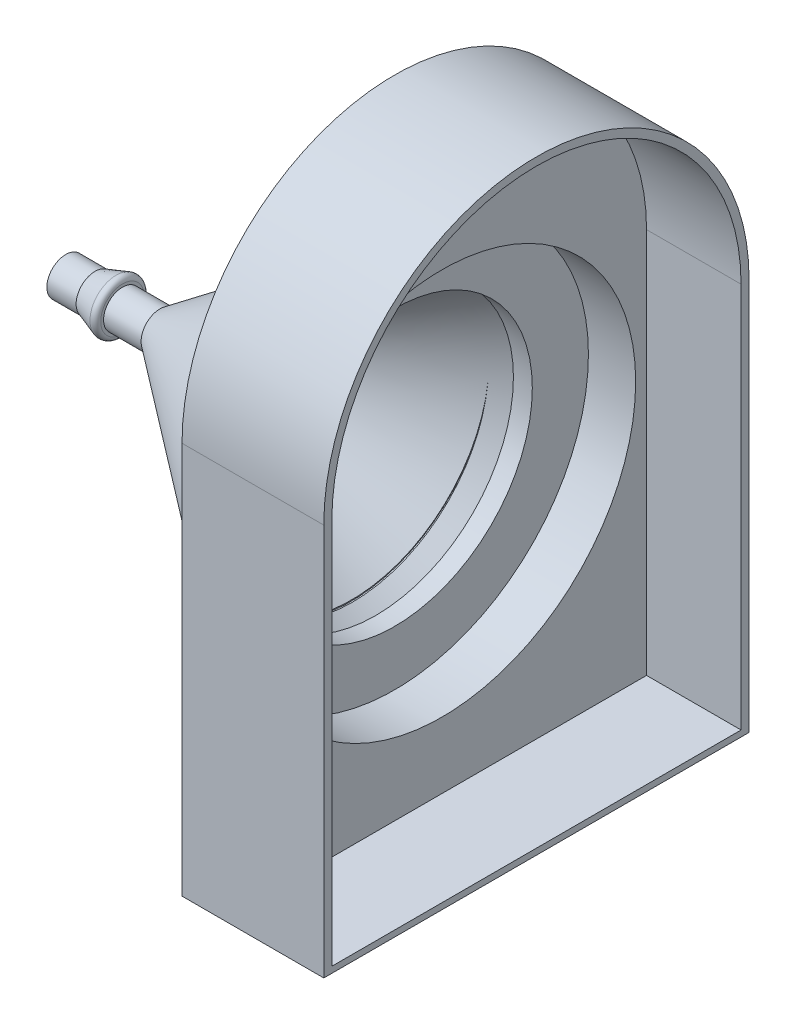
ISO-10303-21;
HEADER;
FILE_DESCRIPTION(('STEP AP214'),'2;1');
FILE_NAME('part.step','',(''),(''),'','','');
FILE_SCHEMA(('AUTOMOTIVE_DESIGN { 1 0 10303 214 1 1 1 1 }'));
ENDSEC;
DATA;
#1=APPLICATION_CONTEXT('core data for automotive mechanical design processes');
#2=APPLICATION_PROTOCOL_DEFINITION('international standard','automotive_design',2000,#1);
#3=PRODUCT_CONTEXT('',#1,'mechanical');
#4=PRODUCT('Part','Part','',(#3));
#5=PRODUCT_RELATED_PRODUCT_CATEGORY('part','',(#4));
#6=PRODUCT_DEFINITION_FORMATION('','',#4);
#7=PRODUCT_DEFINITION_CONTEXT('part definition',#1,'design');
#8=PRODUCT_DEFINITION('design','',#6,#7);
#9=PRODUCT_DEFINITION_SHAPE('','',#8);
#10=(LENGTH_UNIT() NAMED_UNIT(*) SI_UNIT(.MILLI.,.METRE.));
#11=(NAMED_UNIT(*) PLANE_ANGLE_UNIT() SI_UNIT($,.RADIAN.));
#12=(NAMED_UNIT(*) SI_UNIT($,.STERADIAN.) SOLID_ANGLE_UNIT());
#13=UNCERTAINTY_MEASURE_WITH_UNIT(LENGTH_MEASURE(1.E-05),#10,'distance_accuracy_value','');
#14=(GEOMETRIC_REPRESENTATION_CONTEXT(3) GLOBAL_UNCERTAINTY_ASSIGNED_CONTEXT((#13)) GLOBAL_UNIT_ASSIGNED_CONTEXT((#10,
#11,#12)) REPRESENTATION_CONTEXT('',''));
#15=CARTESIAN_POINT('',(0.,0.,0.));
#16=DIRECTION('',(0.,0.,1.));
#17=DIRECTION('',(1.,0.,0.));
#18=AXIS2_PLACEMENT_3D('',#15,#16,#17);
#19=CARTESIAN_POINT('',(-44.196,10.4774140012512,0.));
#20=DIRECTION('',(1.,0.,0.));
#21=DIRECTION('',(0.,0.,-1.));
#22=AXIS2_PLACEMENT_3D('',#19,#20,#21);
#23=CYLINDRICAL_SURFACE('',#22,2.54);
#24=CARTESIAN_POINT('',(-31.496,10.4774140012512,0.));
#25=DIRECTION('',(1.,0.,0.));
#26=DIRECTION('',(0.,0.,-1.));
#27=AXIS2_PLACEMENT_3D('',#24,#25,#26);
#28=CIRCLE('',#27,2.54);
#29=CARTESIAN_POINT('',(-31.496,10.4774140012512,-2.54));
#30=VERTEX_POINT('',#29);
#31=EDGE_CURVE('E69',#30,#30,#28,.T.);
#32=ORIENTED_EDGE('',*,*,#31,.F.);
#33=EDGE_LOOP('',(#32));
#34=FACE_BOUND('',#33,.T.);
#35=CARTESIAN_POINT('',(-36.576,10.4774140012512,0.));
#36=DIRECTION('',(-1.,0.,0.));
#37=DIRECTION('',(0.,0.,1.));
#38=AXIS2_PLACEMENT_3D('',#35,#36,#37);
#39=CIRCLE('',#38,2.54);
#40=CARTESIAN_POINT('',(-36.576,10.4774140012512,2.54));
#41=VERTEX_POINT('',#40);
#42=EDGE_CURVE('E78',#41,#41,#39,.T.);
#43=ORIENTED_EDGE('',*,*,#42,.F.);
#44=EDGE_LOOP('',(#43));
#45=FACE_BOUND('',#44,.T.);
#46=ADVANCED_FACE('F54',(#34,#45),#23,.T.);
#47=CARTESIAN_POINT('',(-44.196,10.4774140012512,0.));
#48=DIRECTION('',(1.,0.,0.));
#49=DIRECTION('',(0.,0.,-1.));
#50=AXIS2_PLACEMENT_3D('',#47,#48,#49);
#51=CIRCLE('',#50,2.54);
#52=CARTESIAN_POINT('',(-44.196,10.4774140012512,-2.54));
#53=VERTEX_POINT('',#52);
#54=EDGE_CURVE('E65',#53,#53,#51,.T.);
#55=ORIENTED_EDGE('',*,*,#54,.T.);
#56=EDGE_LOOP('',(#55));
#57=FACE_BOUND('',#56,.T.);
#58=CARTESIAN_POINT('',(-40.2646161105656,10.4774140012512,0.));
#59=DIRECTION('',(-1.,0.,0.));
#60=DIRECTION('',(0.,0.,1.));
#61=AXIS2_PLACEMENT_3D('',#58,#59,#60);
#62=CIRCLE('',#61,2.54);
#63=CARTESIAN_POINT('',(-40.2646161105656,10.4774140012512,2.54));
#64=VERTEX_POINT('',#63);
#65=EDGE_CURVE('E83',#64,#64,#62,.T.);
#66=ORIENTED_EDGE('',*,*,#65,.T.);
#67=EDGE_LOOP('',(#66));
#68=FACE_BOUND('',#67,.T.);
#69=ADVANCED_FACE('F87',(#57,#68),#23,.T.);
#70=CARTESIAN_POINT('',(-44.196,10.4774140012512,0.));
#71=DIRECTION('',(1.,0.,0.));
#72=DIRECTION('',(0.,0.,-1.));
#73=AXIS2_PLACEMENT_3D('',#70,#71,#72);
#74=PLANE('',#73);
#75=CARTESIAN_POINT('',(-44.196,10.4774140012512,0.));
#76=DIRECTION('',(1.,0.,0.));
#77=DIRECTION('',(0.,0.,-1.));
#78=AXIS2_PLACEMENT_3D('',#75,#76,#77);
#79=CIRCLE('',#78,1.27);
#80=CARTESIAN_POINT('',(-44.196,10.4774140012512,-1.27));
#81=VERTEX_POINT('',#80);
#82=EDGE_CURVE('E73',#81,#81,#79,.T.);
#83=ORIENTED_EDGE('',*,*,#82,.T.);
#84=EDGE_LOOP('',(#83));
#85=FACE_BOUND('',#84,.T.);
#86=ORIENTED_EDGE('',*,*,#54,.F.);
#87=EDGE_LOOP('',(#86));
#88=FACE_BOUND('',#87,.T.);
#89=ADVANCED_FACE('F105',(#85,#88),#74,.F.);
#90=CARTESIAN_POINT('',(-31.496,10.4774140012512,0.));
#91=DIRECTION('',(1.,0.,0.));
#92=DIRECTION('',(0.,0.,-1.));
#93=AXIS2_PLACEMENT_3D('',#90,#91,#92);
#94=PLANE('',#93);
#95=CARTESIAN_POINT('',(-31.496,10.4774140012512,0.));
#96=DIRECTION('',(1.,0.,0.));
#97=DIRECTION('',(0.,0.,-1.));
#98=AXIS2_PLACEMENT_3D('',#95,#96,#97);
#99=CIRCLE('',#98,1.27);
#100=CARTESIAN_POINT('',(-31.496,10.4774140012512,-1.27));
#101=VERTEX_POINT('',#100);
#102=EDGE_CURVE('E75',#101,#101,#99,.T.);
#103=ORIENTED_EDGE('',*,*,#102,.F.);
#104=EDGE_LOOP('',(#103));
#105=FACE_BOUND('',#104,.T.);
#106=ORIENTED_EDGE('',*,*,#31,.T.);
#107=EDGE_LOOP('',(#106));
#108=FACE_BOUND('',#107,.T.);
#109=ADVANCED_FACE('F110',(#105,#108),#94,.T.);
#110=CARTESIAN_POINT('',(-44.196,10.4774140012512,0.));
#111=DIRECTION('',(1.,0.,0.));
#112=DIRECTION('',(0.,0.,-1.));
#113=AXIS2_PLACEMENT_3D('',#110,#111,#112);
#114=CYLINDRICAL_SURFACE('',#113,1.27);
#115=ORIENTED_EDGE('',*,*,#82,.F.);
#116=EDGE_LOOP('',(#115));
#117=FACE_BOUND('',#116,.T.);
#118=ORIENTED_EDGE('',*,*,#102,.T.);
#119=EDGE_LOOP('',(#118));
#120=FACE_BOUND('',#119,.T.);
#121=ADVANCED_FACE('F98',(#117,#120),#114,.F.);
#122=CARTESIAN_POINT('',(-36.576,6.66741400125122,0.));
#123=DIRECTION('',(-1.,0.,0.));
#124=DIRECTION('',(0.,0.,1.));
#125=AXIS2_PLACEMENT_3D('',#122,#123,#124);
#126=PLANE('',#125);
#127=CARTESIAN_POINT('',(-36.576,10.4774140012512,0.));
#128=DIRECTION('',(-1.,0.,0.));
#129=DIRECTION('',(0.,0.,1.));
#130=AXIS2_PLACEMENT_3D('',#127,#128,#129);
#131=CIRCLE('',#130,2.91978391418075);
#132=CARTESIAN_POINT('',(-36.576,10.4774140012512,2.91978391418075));
#133=VERTEX_POINT('',#132);
#134=EDGE_CURVE('E12',#133,#133,#131,.F.);
#135=ORIENTED_EDGE('',*,*,#134,.T.);
#136=EDGE_LOOP('',(#135));
#137=FACE_BOUND('',#136,.T.);
#138=ORIENTED_EDGE('',*,*,#42,.T.);
#139=EDGE_LOOP('',(#138));
#140=FACE_BOUND('',#139,.T.);
#141=ADVANCED_FACE('F91',(#137,#140),#126,.F.);
#142=CARTESIAN_POINT('',(-36.576,10.4774140012512,0.));
#143=DIRECTION('',(1.,0.,0.));
#144=DIRECTION('',(0.,0.,-1.));
#145=AXIS2_PLACEMENT_3D('',#142,#143,#144);
#146=CONICAL_SURFACE('',#145,3.81,0.331590167268356);
#147=CARTESIAN_POINT('',(-37.4177223346097,10.4774140012512,0.));
#148=DIRECTION('',(-1.,0.,0.));
#149=DIRECTION('',(0.,0.,1.));
#150=AXIS2_PLACEMENT_3D('',#147,#148,#149);
#151=CIRCLE('',#150,3.5201928384761);
#152=CARTESIAN_POINT('',(-37.4177223346097,10.4774140012512,3.52019283847611));
#153=VERTEX_POINT('',#152);
#154=EDGE_CURVE('E61',#153,#153,#151,.T.);
#155=ORIENTED_EDGE('',*,*,#154,.T.);
#156=EDGE_LOOP('',(#155));
#157=FACE_BOUND('',#156,.T.);
#158=ORIENTED_EDGE('',*,*,#65,.F.);
#159=EDGE_LOOP('',(#158));
#160=FACE_BOUND('',#159,.T.);
#161=ADVANCED_FACE('F89',(#157,#160),#146,.T.);
#162=CARTESIAN_POINT('',(-37.211,10.4774140012512,0.));
#163=DIRECTION('',(-1.,0.,0.));
#164=DIRECTION('',(0.,0.,1.));
#165=AXIS2_PLACEMENT_3D('',#162,#163,#164);
#166=TOROIDAL_SURFACE('',#165,2.91978391418075,0.635);
#167=ORIENTED_EDGE('',*,*,#134,.F.);
#168=EDGE_LOOP('',(#167));
#169=FACE_BOUND('',#168,.T.);
#170=ORIENTED_EDGE('',*,*,#154,.F.);
#171=EDGE_LOOP('',(#170));
#172=FACE_BOUND('',#171,.T.);
#173=ADVANCED_FACE('F56',(#169,#172),#166,.T.);
#174=CLOSED_SHELL('',(#46,#69,#89,#109,#121,#141,#161,#173));
#175=MANIFOLD_SOLID_BREP('B2',#174);
#176=CARTESIAN_POINT('',(-2.54,10.4774140012512,0.));
#177=DIRECTION('',(1.,0.,0.));
#178=DIRECTION('',(0.,0.,-1.));
#179=AXIS2_PLACEMENT_3D('',#176,#177,#178);
#180=CONICAL_SURFACE('',#179,20.9753037049337,0.640293421318562);
#181=CARTESIAN_POINT('',(-5.842,10.4774140012512,0.));
#182=DIRECTION('',(1.,0.,0.));
#183=DIRECTION('',(0.,0.,-1.));
#184=AXIS2_PLACEMENT_3D('',#181,#182,#183);
#185=CIRCLE('',#184,18.5153137049337);
#186=CARTESIAN_POINT('',(-5.842,8.14576508197144,-18.3679137331741));
#187=VERTEX_POINT('',#186);
#188=CARTESIAN_POINT('',(-5.842,8.14576508197114,18.3679137331741));
#189=VERTEX_POINT('',#188);
#190=EDGE_CURVE('E52',#187,#189,#185,.F.);
#191=ORIENTED_EDGE('',*,*,#190,.F.);
#192=CARTESIAN_POINT('',(-6.05230168996605,26.8157734980068,-8.37243291409508));
#193=CARTESIAN_POINT('',(-6.04980473854419,26.5950424745286,-8.80735233484811));
#194=CARTESIAN_POINT('',(-6.04711275181182,26.3570375411272,-9.23349512453131));
#195=CARTESIAN_POINT('',(-6.04135786034432,25.8481384871763,-10.065649726821));
#196=CARTESIAN_POINT('',(-6.03829496619137,25.5772453049442,-10.4716621132921));
#197=CARTESIAN_POINT('',(-6.03181739071217,25.004226471406,-11.2609883302905));
#198=CARTESIAN_POINT('',(-6.02840272273173,24.70210200497,-11.6443030210686));
#199=CARTESIAN_POINT('',(-6.02124348313159,24.0685191199073,-12.3858543455973));
#200=CARTESIAN_POINT('',(-6.01749891738637,23.7370612236197,-12.7440914257005));
#201=CARTESIAN_POINT('',(-6.00970196539864,23.0467277715894,-13.4334025054827));
#202=CARTESIAN_POINT('',(-6.00564944659553,22.687840408248,-13.7644646785122));
#203=CARTESIAN_POINT('',(-5.99726376630634,21.9450162759844,-14.3971853851101));
#204=CARTESIAN_POINT('',(-5.99293060247672,21.5610792978841,-14.6988436730874));
#205=CARTESIAN_POINT('',(-5.98401460612358,20.7708631384469,-15.2706497765345));
#206=CARTESIAN_POINT('',(-5.97943196211863,20.3646008250212,-15.5408209132644));
#207=CARTESIAN_POINT('',(-5.97004334681625,19.5320343344303,-16.0482065468793));
#208=CARTESIAN_POINT('',(-5.96523740093005,19.105732437657,-16.2854247815272));
#209=CARTESIAN_POINT('',(-5.95631740563273,18.3142615926053,-16.6857363496884));
#210=CARTESIAN_POINT('',(-5.95223492834234,17.9519365433589,-16.8544819146478));
#211=CARTESIAN_POINT('',(-5.94395654448104,17.2170323413388,-17.168198112806));
#212=CARTESIAN_POINT('',(-5.93976061408196,16.8444510341761,-17.3131637056825));
#213=CARTESIAN_POINT('',(-5.93127353683828,16.0906373507087,-17.5786751006344));
#214=CARTESIAN_POINT('',(-5.92698237864394,15.7094039430768,-17.6992179743494));
#215=CARTESIAN_POINT('',(-5.91832455957951,14.9400256205933,-17.9153337696594));
#216=CARTESIAN_POINT('',(-5.91395791480488,14.551882178604,-18.0109119459558));
#217=CARTESIAN_POINT('',(-5.90417517731427,13.6820783210078,-18.1954243530013));
#218=CARTESIAN_POINT('',(-5.89874436188458,13.1990566326072,-18.2780065394556));
#219=CARTESIAN_POINT('',(-5.88782950288641,12.2279563234509,-18.4045940997027));
#220=CARTESIAN_POINT('',(-5.88234545384616,11.7398771824953,-18.4485954644826));
#221=CARTESIAN_POINT('',(-5.87135593013218,10.7614859659437,-18.497750414664));
#222=CARTESIAN_POINT('',(-5.86585044521313,10.2711727966331,-18.5028823160469));
#223=CARTESIAN_POINT('',(-5.85485595529443,9.29168874135649,-18.4742084916179));
#224=CARTESIAN_POINT('',(-5.84936695050591,8.80251787004248,-18.4404022690727));
#225=CARTESIAN_POINT('',(-5.83810483953252,7.7985271883295,-18.3307995971587));
#226=CARTESIAN_POINT('',(-5.8323349368585,7.28397262798859,-18.252556866722));
#227=CARTESIAN_POINT('',(-5.8208932784871,6.2632661442316,-18.0529987201885));
#228=CARTESIAN_POINT('',(-5.815221527603,5.75711463294252,-17.9316811979855));
#229=CARTESIAN_POINT('',(-5.80401585834689,4.75677746534084,-17.6468217221999));
#230=CARTESIAN_POINT('',(-5.79848195378565,4.26259300814015,-17.483275556253));
#231=CARTESIAN_POINT('',(-5.78759169469912,3.28976490473196,-17.115129507112));
#232=CARTESIAN_POINT('',(-5.78223533851479,2.81112111331078,-16.9105300076531));
#233=CARTESIAN_POINT('',(-5.77169891750903,1.86929474659687,-16.4600669296335));
#234=CARTESIAN_POINT('',(-5.76652045140187,1.40625286930386,-16.2139090744741));
#235=CARTESIAN_POINT('',(-5.75641875354378,0.502723108935721,-15.6831741201335));
#236=CARTESIAN_POINT('',(-5.75149552651646,0.0622356432685031,-15.3985963102797));
#237=CARTESIAN_POINT('',(-5.74194028772314,-0.792922650028691,-14.7931320380016));
#238=CARTESIAN_POINT('',(-5.73730822601058,-1.20759790537052,-14.4722518294837));
#239=CARTESIAN_POINT('',(-5.72836742505071,-2.00821147296286,-13.796464007714));
#240=CARTESIAN_POINT('',(-5.72405867202017,-2.3941510102628,-13.4415578465199));
#241=CARTESIAN_POINT('',(-5.71603256668581,-3.1132289032629,-12.7215968051549));
#242=CARTESIAN_POINT('',(-5.71229545760603,-3.44812705523642,-12.3582973189461));
#243=CARTESIAN_POINT('',(-5.70515906494656,-4.08778019817246,-11.6060849901983));
#244=CARTESIAN_POINT('',(-5.70175976491031,-4.39253665750054,-11.2171733969031));
#245=CARTESIAN_POINT('',(-5.69532026878391,-4.96996050268395,-10.416223100135));
#246=CARTESIAN_POINT('',(-5.69228006724037,-5.24262837584599,-10.0041847480122));
#247=CARTESIAN_POINT('',(-5.68657767578494,-5.75414308713789,-9.15960284962658));
#248=CARTESIAN_POINT('',(-5.68391550296606,-5.9929883959392,-8.7270583773341));
#249=CARTESIAN_POINT('',(-5.67885499944746,-6.44706943240713,-7.82078031336759));
#250=CARTESIAN_POINT('',(-5.67647819210605,-6.6603774087399,-7.34607924749692));
#251=CARTESIAN_POINT('',(-5.67217902317542,-7.04625342975241,-6.3803843770447));
#252=CARTESIAN_POINT('',(-5.67025667729301,-7.21882006635654,-5.88939001001341));
#253=CARTESIAN_POINT('',(-5.6668795801219,-7.52200443799372,-4.89453150371542));
#254=CARTESIAN_POINT('',(-5.66542489954797,-7.65261582905294,-4.39066543056518));
#255=CARTESIAN_POINT('',(-5.66299365588127,-7.87092268686198,-3.37372448751583));
#256=CARTESIAN_POINT('',(-5.66201708864364,-7.95861852565595,-2.86064969748903));
#257=CARTESIAN_POINT('',(-5.66054890891197,-8.09046511074899,-1.82899269444716));
#258=CARTESIAN_POINT('',(-5.6600572423712,-8.13462071001457,-1.31041110173072));
#259=CARTESIAN_POINT('',(-5.65956208547841,-8.1790897802088,-0.271370293009217));
#260=CARTESIAN_POINT('',(-5.65955859610024,-8.17940316367742,0.249088926739414));
#261=CARTESIAN_POINT('',(-5.66003981249805,-8.13618604396935,1.28816753880295));
#262=CARTESIAN_POINT('',(-5.66052450322563,-8.09265689226147,1.80678698733524));
#263=CARTESIAN_POINT('',(-5.66197869445956,-7.96206634925218,2.83851486272808));
#264=CARTESIAN_POINT('',(-5.66294819472381,-7.87500497968813,3.35162329234038));
#265=CARTESIAN_POINT('',(-5.66536526812203,-7.65797004677165,4.36867753141245));
#266=CARTESIAN_POINT('',(-5.66681283748241,-7.52799682213878,4.87262341316256));
#267=CARTESIAN_POINT('',(-5.6701760028574,-7.22606230901372,5.86777422282941));
#268=CARTESIAN_POINT('',(-5.67209159892533,-7.05410101573812,6.35897914929466));
#269=CARTESIAN_POINT('',(-5.67637754064079,-6.66941077079271,7.32516237746161));
#270=CARTESIAN_POINT('',(-5.67874789215828,-6.45668129289019,7.80014046961527));
#271=CARTESIAN_POINT('',(-5.68392685305961,-5.99196891453579,8.73048689466527));
#272=CARTESIAN_POINT('',(-5.68673546242937,-5.73998601534472,9.18585522819147));
#273=CARTESIAN_POINT('',(-5.69277157613522,-5.19854285344625,10.0737710916267));
#274=CARTESIAN_POINT('',(-5.69599910478795,-4.90908041519827,10.5063172947473));
#275=CARTESIAN_POINT('',(-5.702850451791,-4.29474801835679,11.3454857108227));
#276=CARTESIAN_POINT('',(-5.70647427029356,-3.96987804616032,11.7521079138177));
#277=CARTESIAN_POINT('',(-5.7140926190938,-3.28706848446988,12.5365056787777));
#278=CARTESIAN_POINT('',(-5.71808711891129,-2.92913161399434,12.9142836078864));
#279=CARTESIAN_POINT('',(-5.72641917328571,-2.18271254121966,13.6383437773436));
#280=CARTESIAN_POINT('',(-5.73075672719462,-1.7942303966197,13.9846260771838));
#281=CARTESIAN_POINT('',(-5.73974401186123,-0.989532198198054,14.6431914995107));
#282=CARTESIAN_POINT('',(-5.74439369906915,-0.573320013417028,14.9554793491335));
#283=CARTESIAN_POINT('',(-5.75397303829735,0.283910463521951,15.543886157369));
#284=CARTESIAN_POINT('',(-5.75890269238121,0.724928938521203,15.8200048493373));
#285=CARTESIAN_POINT('',(-5.76901066241772,1.62892951721605,16.3342639200963));
#286=CARTESIAN_POINT('',(-5.77418909498288,2.09192191972582,16.5723862579526));
#287=CARTESIAN_POINT('',(-5.78211197353838,2.80005922287906,16.8996127717003));
#288=CARTESIAN_POINT('',(-5.78477889295615,3.03838765946818,17.0036983102751));
#289=CARTESIAN_POINT('',(-5.79016103305838,3.51928235305153,17.201758396554));
#290=CARTESIAN_POINT('',(-5.79287626601155,3.76184968618192,17.2957303320473));
#291=CARTESIAN_POINT('',(-5.80109016193194,4.49552197737526,17.562293662239));
#292=CARTESIAN_POINT('',(-5.80665414322904,4.99233992100443,17.7194137085111));
#293=CARTESIAN_POINT('',(-5.81791453497745,5.99745451997204,17.9911812709801));
#294=CARTESIAN_POINT('',(-5.82361094470221,6.50575111233481,18.1058290201339));
#295=CARTESIAN_POINT('',(-5.83221835040813,7.27353043043318,18.2452579294493));
#296=CARTESIAN_POINT('',(-5.83509574607454,7.5301494118166,18.2862916400122));
#297=CARTESIAN_POINT('',(-5.84086761491574,8.04482052828199,18.3575066907022));
#298=CARTESIAN_POINT('',(-5.8437620838429,8.30287230603421,18.3876906232303));
#299=CARTESIAN_POINT('',(-5.85246253477148,9.07841073055843,18.461867012552));
#300=CARTESIAN_POINT('',(-5.85828888968606,9.59757739748629,18.4895379458712));
#301=CARTESIAN_POINT('',(-5.86800689044177,10.4632096630318,18.499178662862));
#302=CARTESIAN_POINT('',(-5.87189664859658,10.8096088730079,18.4932994681876));
#303=CARTESIAN_POINT('',(-5.87966825605479,11.5015406006295,18.4621109019674));
#304=CARTESIAN_POINT('',(-5.88355010515047,11.8470730955661,18.436801026541));
#305=CARTESIAN_POINT('',(-5.8932287381555,12.7083892935413,18.3493140581702));
#306=CARTESIAN_POINT('',(-5.89901362526704,13.2230133313104,18.2750372924714));
#307=CARTESIAN_POINT('',(-5.90762493508412,13.9888116873123,18.1313664366136));
#308=CARTESIAN_POINT('',(-5.9104851900944,14.2431278933992,18.0780800156546));
#309=CARTESIAN_POINT('',(-5.91617962274307,14.7493548692327,17.9608315560037));
#310=CARTESIAN_POINT('',(-5.91901379408798,15.0012650589825,17.8968670086382));
#311=CARTESIAN_POINT('',(-5.92747735322752,15.753405291458,17.6889076856936));
#312=CARTESIAN_POINT('',(-5.93305973663687,16.249329175703,17.5289815555392));
#313=CARTESIAN_POINT('',(-5.94405586332864,17.2258742441431,17.1678913418286));
#314=CARTESIAN_POINT('',(-5.94946960209103,17.7064950181896,16.9667261540707));
#315=CARTESIAN_POINT('',(-5.96008580188136,18.6486816284183,16.5247608640005));
#316=CARTESIAN_POINT('',(-5.96528843654291,19.1102631298391,16.283994193052));
#317=CARTESIAN_POINT('',(-5.97544977920616,20.011512993004,15.7644106427805));
#318=CARTESIAN_POINT('',(-5.98040847895719,20.4511806135564,15.485592477635));
#319=CARTESIAN_POINT('',(-5.99004400812662,21.3052804130955,14.8920271571505));
#320=CARTESIAN_POINT('',(-5.99472094743696,21.7197224312067,14.5772941497217));
#321=CARTESIAN_POINT('',(-6.00376186929891,22.5206612960334,13.9139915981273));
#322=CARTESIAN_POINT('',(-6.00812585867281,22.9071587519388,13.5654227919684));
#323=CARTESIAN_POINT('',(-6.01441155557897,23.4637163491039,13.0192337759626));
#324=CARTESIAN_POINT('',(-6.01646334719252,23.6453655186486,12.8332875877241));
#325=CARTESIAN_POINT('',(-6.02047661988527,24.0006261053105,12.453954289395));
#326=CARTESIAN_POINT('',(-6.02243812360583,24.1742395375986,12.260569067356));
#327=CARTESIAN_POINT('',(-6.02818284880659,24.6826495260526,11.6696592201856));
#328=CARTESIAN_POINT('',(-6.03182662672779,25.0050460893504,11.2613506551625));
#329=CARTESIAN_POINT('',(-6.03871768580478,25.6146371445514,10.4185670762912));
#330=CARTESIAN_POINT('',(-6.04196452997493,25.9017928409883,9.98406399643973));
#331=CARTESIAN_POINT('',(-6.04651585434817,26.3042493956073,9.31541389683631));
#332=CARTESIAN_POINT('',(-6.04797997095032,26.4337033733711,9.08968491579751));
#333=CARTESIAN_POINT('',(-6.05079951384009,26.6829805551179,8.63296037192603));
#334=CARTESIAN_POINT('',(-6.05215493664721,26.8028034507029,8.40196464074988));
#335=CARTESIAN_POINT('',(-6.05345486857955,26.9177121653013,8.1685173981972));
#336=B_SPLINE_CURVE_WITH_KNOTS('',3,(#192,#193,#194,#195,#196,#197,#198,#199,#200,#201,#202,
#203,#204,#205,#206,#207,#208,#209,#210,#211,#212,#213,#214,#215,#216,#217,#218,#219,#220,#221,
#222,#223,#224,#225,#226,#227,#228,#229,#230,#231,#232,#233,#234,#235,#236,#237,#238,#239,#240,
#241,#242,#243,#244,#245,#246,#247,#248,#249,#250,#251,#252,#253,#254,#255,#256,#257,#258,#259,
#260,#261,#262,#263,#264,#265,#266,#267,#268,#269,#270,#271,#272,#273,#274,#275,#276,#277,#278,
#279,#280,#281,#282,#283,#284,#285,#286,#287,#288,#289,#290,#291,#292,#293,#294,#295,#296,#297,
#298,#299,#300,#301,#302,#303,#304,#305,#306,#307,#308,#309,#310,#311,#312,#313,#314,#315,#316,
#317,#318,#319,#320,#321,#322,#323,#324,#325,#326,#327,#328,#329,#330,#331,#332,#333,#334,#335),
.UNSPECIFIED.,.F.,.F.,(4,2,2,2,2,2,2,2,2,2,2,2,2,2,2,2,2,2,2,2,2,2,2,2,2,2,2,2,2,2,2,2,2,2,2,2,
2,2,2,2,2,2,2,2,2,2,2,2,2,2,2,2,2,2,2,2,2,2,2,2,2,2,2,2,2,2,2,2,2,2,2,4),(0.,1.46280698227276,
2.92557223977068,4.38828202240895,5.85096576388016,7.31428273402212,8.77761192523487,
10.2398503055664,11.701922692296,12.9002585857491,14.0988481471476,15.2975813382497,
16.4960620099559,17.9646473138012,19.4333852033044,20.9029423939469,22.3725183319248,
23.9321526167177,25.4918631690368,27.0517293647363,28.6115809806765,30.1829806503846,
31.7544093910244,33.3255678286855,34.8966592469625,36.377461191992,37.8581909635478,
39.3388982454031,40.8196724578825,42.3790948871979,43.9385712043668,45.4982832161401,
47.0579817061953,48.6175063336242,50.1770340721202,51.736513738839,53.2959926268487,
54.8554592055942,56.4149259619991,57.9744128492415,59.5338996863937,61.0934770862693,
62.6530550853094,64.2125049576271,65.7719518842578,67.3311816824978,68.8904229749583,
70.4504024171616,71.2304423215777,72.0106832189715,73.5720126046771,75.1333334264952,
75.9128130581658,76.6921063202078,78.2497902626564,79.2887117073477,80.3276600944897,
81.8855020209918,82.6648762503001,83.4444338408211,85.0057270654598,86.5670621001661,
88.1270857660285,89.6871621607128,91.2466261033608,92.8060560395241,93.5857227310568,
94.3651928295414,95.9240059937347,97.4845200950371,98.26497514119,99.045455168442),.UNSPECIFIED.);
#337=EDGE_CURVE('E222',#187,#189,#336,.T.);
#338=ORIENTED_EDGE('',*,*,#337,.T.);
#339=EDGE_LOOP('',(#191,#338));
#340=FACE_BOUND('',#339,.T.);
#341=CARTESIAN_POINT('',(-27.2853741005821,10.4774140012512,0.));
#342=DIRECTION('',(1.,0.,0.));
#343=DIRECTION('',(0.,0.,-1.));
#344=AXIS2_PLACEMENT_3D('',#341,#342,#343);
#345=CIRCLE('',#344,2.54);
#346=CARTESIAN_POINT('',(-27.2853741005821,10.4774140012512,-2.54));
#347=VERTEX_POINT('',#346);
#348=EDGE_CURVE('E263',#347,#347,#345,.F.);
#349=ORIENTED_EDGE('',*,*,#348,.T.);
#350=EDGE_LOOP('',(#349));
#351=FACE_BOUND('',#350,.T.);
#352=CARTESIAN_POINT('',(-2.54,10.4774140012512,0.));
#353=DIRECTION('',(1.,0.,0.));
#354=DIRECTION('',(0.,0.,-1.));
#355=AXIS2_PLACEMENT_3D('',#352,#353,#354);
#356=CIRCLE('',#355,20.9753037049337);
#357=CARTESIAN_POINT('',(-2.54,10.4774140012512,-20.9753037049337));
#358=VERTEX_POINT('',#357);
#359=EDGE_CURVE('E227',#358,#358,#356,.T.);
#360=ORIENTED_EDGE('',*,*,#359,.T.);
#361=EDGE_LOOP('',(#360));
#362=FACE_BOUND('',#361,.T.);
#363=ADVANCED_FACE('F200',(#340,#351,#362),#180,.F.);
#364=CARTESIAN_POINT('',(-2.54,0.,0.));
#365=DIRECTION('',(-1.,0.,0.));
#366=DIRECTION('',(0.,0.,1.));
#367=AXIS2_PLACEMENT_3D('',#364,#365,#366);
#368=PLANE('',#367);
#369=CARTESIAN_POINT('',(-2.54,10.3226947982085,0.));
#370=DIRECTION('',(-1.,0.,0.));
#371=DIRECTION('',(0.,0.,1.));
#372=AXIS2_PLACEMENT_3D('',#369,#370,#371);
#373=CIRCLE('',#372,18.4964666328129);
#374=CARTESIAN_POINT('',(-2.54,10.3226947982085,18.4964666328129));
#375=VERTEX_POINT('',#374);
#376=EDGE_CURVE('E223',#375,#375,#373,.T.);
#377=ORIENTED_EDGE('',*,*,#376,.F.);
#378=EDGE_LOOP('',(#377));
#379=FACE_BOUND('',#378,.T.);
#380=ORIENTED_EDGE('',*,*,#359,.F.);
#381=EDGE_LOOP('',(#380));
#382=FACE_BOUND('',#381,.T.);
#383=ADVANCED_FACE('F247',(#379,#382),#368,.T.);
#384=CARTESIAN_POINT('',(-5.842,10.3226947982085,0.));
#385=DIRECTION('',(1.,0.,0.));
#386=DIRECTION('',(0.,0.,-1.));
#387=AXIS2_PLACEMENT_3D('',#384,#385,#386);
#388=CYLINDRICAL_SURFACE('',#387,18.4964666328129);
#389=ORIENTED_EDGE('',*,*,#376,.T.);
#390=EDGE_LOOP('',(#389));
#391=FACE_BOUND('',#390,.T.);
#392=CARTESIAN_POINT('',(0.,10.3226947982085,0.));
#393=DIRECTION('',(1.,0.,0.));
#394=DIRECTION('',(0.,0.,-1.));
#395=AXIS2_PLACEMENT_3D('',#392,#393,#394);
#396=CIRCLE('',#395,18.4964666328129);
#397=CARTESIAN_POINT('',(0.,10.3226947982085,-18.4964666328129));
#398=VERTEX_POINT('',#397);
#399=EDGE_CURVE('E224',#398,#398,#396,.T.);
#400=ORIENTED_EDGE('',*,*,#399,.T.);
#401=EDGE_LOOP('',(#400));
#402=FACE_BOUND('',#401,.T.);
#403=ADVANCED_FACE('F243',(#391,#402),#388,.F.);
#404=CARTESIAN_POINT('',(-5.842,10.3226947982085,0.));
#405=DIRECTION('',(1.,0.,0.));
#406=DIRECTION('',(0.,0.,-1.));
#407=AXIS2_PLACEMENT_3D('',#404,#405,#406);
#408=PLANE('',#407);
#409=ORIENTED_EDGE('',*,*,#190,.T.);
#410=CARTESIAN_POINT('',(-5.842,10.3226947982085,0.));
#411=DIRECTION('',(1.,0.,0.));
#412=DIRECTION('',(0.,0.,-1.));
#413=AXIS2_PLACEMENT_3D('',#410,#411,#412);
#414=CIRCLE('',#413,18.4964666328129);
#415=EDGE_CURVE('E214',#189,#187,#414,.T.);
#416=ORIENTED_EDGE('',*,*,#415,.T.);
#417=EDGE_LOOP('',(#409,#416));
#418=FACE_BOUND('',#417,.T.);
#419=ADVANCED_FACE('F217',(#418),#408,.T.);
#420=ORIENTED_EDGE('',*,*,#415,.F.);
#421=ORIENTED_EDGE('',*,*,#337,.F.);
#422=EDGE_LOOP('',(#420,#421));
#423=FACE_BOUND('',#422,.T.);
#424=ADVANCED_FACE('F221',(#423),#388,.F.);
#425=CARTESIAN_POINT('',(0.,10.4774140012512,0.));
#426=DIRECTION('',(1.,0.,0.));
#427=DIRECTION('',(0.,0.,-1.));
#428=AXIS2_PLACEMENT_3D('',#425,#426,#427);
#429=CONICAL_SURFACE('',#428,26.035,0.640293421318562);
#430=CARTESIAN_POINT('',(-31.5369127516778,10.4774140012512,0.));
#431=DIRECTION('',(1.,0.,0.));
#432=DIRECTION('',(0.,0.,-1.));
#433=AXIS2_PLACEMENT_3D('',#430,#431,#432);
#434=CIRCLE('',#433,2.54);
#435=CARTESIAN_POINT('',(-31.5369127516778,10.4774140012512,-2.54));
#436=VERTEX_POINT('',#435);
#437=EDGE_CURVE('E204',#436,#436,#434,.F.);
#438=CARTESIAN_POINT('',(0.,10.4774140012512,0.));
#439=DIRECTION('',(1.,0.,0.));
#440=DIRECTION('',(0.,0.,-1.));
#441=AXIS2_PLACEMENT_3D('',#438,#439,#440);
#442=CIRCLE('',#441,26.035);
#443=CARTESIAN_POINT('',(0.,10.4774140012512,-26.035));
#444=VERTEX_POINT('',#443);
#445=EDGE_CURVE('E209',#444,#444,#442,.T.);
#446=CARTESIAN_POINT('',(-31.5369127516778,10.4774140012512,-2.54));
#447=CARTESIAN_POINT('',(-31.2084032438479,10.4774140012512,-2.78473958333333));
#448=CARTESIAN_POINT('',(-30.8798937360179,10.4774140012512,-3.02947916666666));
#449=CARTESIAN_POINT('',(-30.2228747203579,10.4774140012512,-3.51895833333333));
#450=CARTESIAN_POINT('',(-29.894365212528,10.4774140012512,-3.76369791666666));
#451=CARTESIAN_POINT('',(-29.237346196868,10.4774140012512,-4.25317708333333));
#452=CARTESIAN_POINT('',(-28.908836689038,10.4774140012512,-4.49791666666667));
#453=CARTESIAN_POINT('',(-28.2518176733781,10.4774140012512,-4.98739583333334));
#454=CARTESIAN_POINT('',(-27.9233081655481,10.4774140012512,-5.23213541666667));
#455=CARTESIAN_POINT('',(-27.2662891498881,10.4774140012512,-5.72161458333333));
#456=CARTESIAN_POINT('',(-26.9377796420582,10.4774140012512,-5.96635416666667));
#457=CARTESIAN_POINT('',(-26.2807606263982,10.4774140012512,-6.45583333333333));
#458=CARTESIAN_POINT('',(-25.9522511185682,10.4774140012512,-6.70057291666666));
#459=CARTESIAN_POINT('',(-25.2952321029083,10.4774140012512,-7.19005208333333));
#460=CARTESIAN_POINT('',(-24.9667225950783,10.4774140012512,-7.43479166666666));
#461=CARTESIAN_POINT('',(-24.3097035794183,10.4774140012512,-7.92427083333333));
#462=CARTESIAN_POINT('',(-23.9811940715884,10.4774140012512,-8.16901041666667));
#463=CARTESIAN_POINT('',(-23.3241750559284,10.4774140012512,-8.65848958333333));
#464=CARTESIAN_POINT('',(-22.9956655480984,10.4774140012512,-8.90322916666667));
#465=CARTESIAN_POINT('',(-22.3386465324385,10.4774140012512,-9.39270833333333));
#466=CARTESIAN_POINT('',(-22.0101370246085,10.4774140012512,-9.63744791666667));
#467=CARTESIAN_POINT('',(-21.3531180089485,10.4774140012512,-10.1269270833333));
#468=CARTESIAN_POINT('',(-21.0246085011186,10.4774140012512,-10.3716666666667));
#469=CARTESIAN_POINT('',(-20.3675894854586,10.4774140012512,-10.8611458333333));
#470=CARTESIAN_POINT('',(-20.0390799776286,10.4774140012512,-11.1058854166667));
#471=CARTESIAN_POINT('',(-19.3820609619687,10.4774140012512,-11.5953645833333));
#472=CARTESIAN_POINT('',(-19.0535514541387,10.4774140012512,-11.8401041666667));
#473=CARTESIAN_POINT('',(-18.3965324384787,10.4774140012512,-12.3295833333333));
#474=CARTESIAN_POINT('',(-18.0680229306488,10.4774140012512,-12.5743229166667));
#475=CARTESIAN_POINT('',(-17.4110039149888,10.4774140012512,-13.0638020833333));
#476=CARTESIAN_POINT('',(-17.0824944071588,10.4774140012512,-13.3085416666667));
#477=CARTESIAN_POINT('',(-16.4254753914989,10.4774140012512,-13.7980208333333));
#478=CARTESIAN_POINT('',(-16.0969658836689,10.4774140012512,-14.0427604166667));
#479=CARTESIAN_POINT('',(-15.4399468680089,10.4774140012512,-14.5322395833333));
#480=CARTESIAN_POINT('',(-15.111437360179,10.4774140012512,-14.7769791666667));
#481=CARTESIAN_POINT('',(-14.454418344519,10.4774140012512,-15.2664583333333));
#482=CARTESIAN_POINT('',(-14.125908836689,10.4774140012512,-15.5111979166667));
#483=CARTESIAN_POINT('',(-13.4688898210291,10.4774140012512,-16.0006770833333));
#484=CARTESIAN_POINT('',(-13.1403803131991,10.4774140012512,-16.2454166666667));
#485=CARTESIAN_POINT('',(-12.4833612975391,10.4774140012512,-16.7348958333333));
#486=CARTESIAN_POINT('',(-12.1548517897092,10.4774140012512,-16.9796354166667));
#487=CARTESIAN_POINT('',(-11.4978327740492,10.4774140012512,-17.4691145833333));
#488=CARTESIAN_POINT('',(-11.1693232662192,10.4774140012512,-17.7138541666667));
#489=CARTESIAN_POINT('',(-10.5123042505593,10.4774140012512,-18.2033333333333));
#490=CARTESIAN_POINT('',(-10.1837947427293,10.4774140012512,-18.4480729166667));
#491=CARTESIAN_POINT('',(-9.52677572706935,10.4774140012512,-18.9375520833333));
#492=CARTESIAN_POINT('',(-9.19826621923937,10.4774140012512,-19.1822916666667));
#493=CARTESIAN_POINT('',(-8.54124720357941,10.4774140012512,-19.6717708333333));
#494=CARTESIAN_POINT('',(-8.21273769574944,10.4774140012512,-19.9165104166667));
#495=CARTESIAN_POINT('',(-7.55571868008948,10.4774140012512,-20.4059895833333));
#496=CARTESIAN_POINT('',(-7.22720917225951,10.4774140012512,-20.6507291666667));
#497=CARTESIAN_POINT('',(-6.57019015659955,10.4774140012512,-21.1402083333333));
#498=CARTESIAN_POINT('',(-6.24168064876957,10.4774140012512,-21.3849479166667));
#499=CARTESIAN_POINT('',(-5.58466163310962,10.4774140012512,-21.8744270833333));
#500=CARTESIAN_POINT('',(-5.25615212527964,10.4774140012512,-22.1191666666667));
#501=CARTESIAN_POINT('',(-4.59913310961969,10.4774140012512,-22.6086458333333));
#502=CARTESIAN_POINT('',(-4.27062360178971,10.4774140012512,-22.8533854166667));
#503=CARTESIAN_POINT('',(-3.61360458612975,10.4774140012512,-23.3428645833333));
#504=CARTESIAN_POINT('',(-3.28509507829978,10.4774140012512,-23.5876041666667));
#505=CARTESIAN_POINT('',(-2.62807606263982,10.4774140012512,-24.0770833333333));
#506=CARTESIAN_POINT('',(-2.29956655480984,10.4774140012512,-24.3218229166667));
#507=CARTESIAN_POINT('',(-1.64254753914989,10.4774140012512,-24.8113020833333));
#508=CARTESIAN_POINT('',(-1.31403803131991,10.4774140012512,-25.0560416666667));
#509=CARTESIAN_POINT('',(-0.657019015659955,10.4774140012512,-25.5455208333333));
#510=CARTESIAN_POINT('',(-0.328509507829978,10.4774140012512,-25.7902604166667));
#511=CARTESIAN_POINT('',(0.,10.4774140012512,-26.035));
#512=B_SPLINE_CURVE_WITH_KNOTS('',3,(#446,#447,#448,#449,#450,#451,#452,#453,#454,#455,#456,
#457,#458,#459,#460,#461,#462,#463,#464,#465,#466,#467,#468,#469,#470,#471,#472,#473,#474,#475,
#476,#477,#478,#479,#480,#481,#482,#483,#484,#485,#486,#487,#488,#489,#490,#491,#492,#493,#494,
#495,#496,#497,#498,#499,#500,#501,#502,#503,#504,#505,#506,#507,#508,#509,#510,#511),
.UNSPECIFIED.,.F.,.F.,(4,2,2,2,2,2,2,2,2,2,2,2,2,2,2,2,2,2,2,2,2,2,2,2,2,2,2,2,2,2,2,2,4),(0.,
1.22896039133237,2.45792078266474,3.68688117399711,4.91584156532948,6.14480195666185,
7.37376234799421,8.60272273932658,9.83168313065895,11.0606435219913,12.2896039133237,
13.5185643046561,14.7475246959884,15.9764850873208,17.2054454786532,18.4344058699855,
19.6633662613179,20.8923266526503,22.1212870439826,23.350247435315,24.5792078266474,
25.8081682179797,27.0371286093121,28.2660890006445,29.4950493919768,30.7240097833092,
31.9529701746416,33.181930565974,34.4108909573063,35.6398513486387,36.8688117399711,
38.0977721313034,39.3267325226358),.UNSPECIFIED.);
#513=EDGE_CURVE('BSEAM202',#436,#444,#512,.T.);
#514=ORIENTED_EDGE('',*,*,#437,.F.);
#515=ORIENTED_EDGE('',*,*,#445,.F.);
#516=ORIENTED_EDGE('',*,*,#513,.T.);
#517=ORIENTED_EDGE('',*,*,#513,.F.);
#518=EDGE_LOOP('',(#514,#516,#515,#517));
#519=FACE_BOUND('',#518,.T.);
#520=ADVANCED_FACE('F202',(#519),#429,.T.);
#521=CARTESIAN_POINT('',(0.,0.,0.));
#522=DIRECTION('',(-1.,0.,0.));
#523=DIRECTION('',(0.,0.,1.));
#524=AXIS2_PLACEMENT_3D('',#521,#522,#523);
#525=PLANE('',#524);
#526=ORIENTED_EDGE('',*,*,#399,.F.);
#527=EDGE_LOOP('',(#526));
#528=FACE_BOUND('',#527,.T.);
#529=ORIENTED_EDGE('',*,*,#445,.T.);
#530=EDGE_LOOP('',(#529));
#531=FACE_BOUND('',#530,.T.);
#532=ADVANCED_FACE('F275',(#528,#531),#525,.F.);
#533=CARTESIAN_POINT('',(-66.802,10.4774140012512,0.));
#534=DIRECTION('',(1.,0.,0.));
#535=DIRECTION('',(0.,0.,-1.));
#536=AXIS2_PLACEMENT_3D('',#533,#534,#535);
#537=CYLINDRICAL_SURFACE('',#536,2.54);
#538=ORIENTED_EDGE('',*,*,#437,.T.);
#539=EDGE_LOOP('',(#538));
#540=FACE_BOUND('',#539,.T.);
#541=ORIENTED_EDGE('',*,*,#348,.F.);
#542=EDGE_LOOP('',(#541));
#543=FACE_BOUND('',#542,.T.);
#544=ADVANCED_FACE('F270',(#540,#543),#537,.F.);
#545=CLOSED_SHELL('',(#363,#383,#403,#419,#424,#520,#532,#544));
#546=MANIFOLD_SOLID_BREP('B7',#545);
#547=CARTESIAN_POINT('',(19.05,0.,0.));
#548=DIRECTION('',(1.,0.,0.));
#549=DIRECTION('',(0.,0.,-1.));
#550=AXIS2_PLACEMENT_3D('',#547,#548,#549);
#551=PLANE('',#550);
#552=DIRECTION('',(0.,-1.,0.));
#553=VECTOR('',#552,1.);
#554=CARTESIAN_POINT('',(19.05,0.,-28.575));
#555=LINE('',#554,#553);
#556=CARTESIAN_POINT('',(19.05,27.4319140012512,-28.575));
#557=VERTEX_POINT('',#556);
#558=CARTESIAN_POINT('',(19.05,-25.2730859987488,-28.575));
#559=VERTEX_POINT('',#558);
#560=EDGE_CURVE('E460',#557,#559,#555,.T.);
#561=ORIENTED_EDGE('',*,*,#560,.F.);
#562=CARTESIAN_POINT('',(19.05,27.4319140012512,0.));
#563=DIRECTION('',(1.,0.,0.));
#564=DIRECTION('',(0.,0.,-1.));
#565=AXIS2_PLACEMENT_3D('',#562,#563,#564);
#566=CIRCLE('',#565,28.575);
#567=CARTESIAN_POINT('',(19.05,27.4319140012512,28.575));
#568=VERTEX_POINT('',#567);
#569=EDGE_CURVE('E462',#557,#568,#566,.T.);
#570=ORIENTED_EDGE('',*,*,#569,.T.);
#571=DIRECTION('',(0.,-1.,0.));
#572=VECTOR('',#571,1.);
#573=CARTESIAN_POINT('',(19.05,0.,28.575));
#574=LINE('',#573,#572);
#575=CARTESIAN_POINT('',(19.05,-25.2730859987488,28.575));
#576=VERTEX_POINT('',#575);
#577=EDGE_CURVE('E465',#568,#576,#574,.T.);
#578=ORIENTED_EDGE('',*,*,#577,.T.);
#579=DIRECTION('',(0.,0.,-1.));
#580=VECTOR('',#579,1.);
#581=CARTESIAN_POINT('',(19.05,-25.2730859987488,0.));
#582=LINE('',#581,#580);
#583=EDGE_CURVE('E372',#576,#559,#582,.T.);
#584=ORIENTED_EDGE('',*,*,#583,.T.);
#585=EDGE_LOOP('',(#561,#570,#578,#584));
#586=FACE_BOUND('',#585,.T.);
#587=CARTESIAN_POINT('',(19.05,27.4319140012512,0.));
#588=DIRECTION('',(1.,0.,0.));
#589=DIRECTION('',(0.,0.,-1.));
#590=AXIS2_PLACEMENT_3D('',#587,#588,#589);
#591=CIRCLE('',#590,27.4955);
#592=CARTESIAN_POINT('',(19.05,27.4319140012512,-27.4955));
#593=VERTEX_POINT('',#592);
#594=CARTESIAN_POINT('',(19.05,27.4319140012512,27.4955));
#595=VERTEX_POINT('',#594);
#596=EDGE_CURVE('E446',#593,#595,#591,.T.);
#597=ORIENTED_EDGE('',*,*,#596,.F.);
#598=DIRECTION('',(0.,-1.,0.));
#599=VECTOR('',#598,1.);
#600=CARTESIAN_POINT('',(19.05,0.,-27.4955));
#601=LINE('',#600,#599);
#602=CARTESIAN_POINT('',(19.05,-24.4475859987488,-27.4955));
#603=VERTEX_POINT('',#602);
#604=EDGE_CURVE('E363',#593,#603,#601,.T.);
#605=ORIENTED_EDGE('',*,*,#604,.T.);
#606=DIRECTION('',(0.,0.,1.));
#607=VECTOR('',#606,1.);
#608=CARTESIAN_POINT('',(19.05,-24.4475859987488,0.));
#609=LINE('',#608,#607);
#610=CARTESIAN_POINT('',(19.05,-24.4475859987488,27.4955));
#611=VERTEX_POINT('',#610);
#612=EDGE_CURVE('E435',#603,#611,#609,.T.);
#613=ORIENTED_EDGE('',*,*,#612,.T.);
#614=DIRECTION('',(0.,-1.,0.));
#615=VECTOR('',#614,1.);
#616=CARTESIAN_POINT('',(19.05,0.,27.4955));
#617=LINE('',#616,#615);
#618=EDGE_CURVE('E449',#595,#611,#617,.T.);
#619=ORIENTED_EDGE('',*,*,#618,.F.);
#620=EDGE_LOOP('',(#597,#605,#613,#619));
#621=FACE_BOUND('',#620,.T.);
#622=ADVANCED_FACE('F348',(#586,#621),#551,.T.);
#623=CARTESIAN_POINT('',(19.05,0.,-28.575));
#624=DIRECTION('',(0.,0.,-1.));
#625=DIRECTION('',(-1.,0.,0.));
#626=AXIS2_PLACEMENT_3D('',#623,#624,#625);
#627=PLANE('',#626);
#628=DIRECTION('',(0.,-1.,0.));
#629=VECTOR('',#628,1.);
#630=CARTESIAN_POINT('',(0.,0.,-28.575));
#631=LINE('',#630,#629);
#632=CARTESIAN_POINT('',(0.,27.4319140012512,-28.575));
#633=VERTEX_POINT('',#632);
#634=CARTESIAN_POINT('',(0.,-25.2730859987488,-28.575));
#635=VERTEX_POINT('',#634);
#636=EDGE_CURVE('E456',#633,#635,#631,.T.);
#637=ORIENTED_EDGE('',*,*,#636,.F.);
#638=DIRECTION('',(-1.,0.,0.));
#639=VECTOR('',#638,1.);
#640=CARTESIAN_POINT('',(19.05,27.4319140012512,-28.575));
#641=LINE('',#640,#639);
#642=EDGE_CURVE('E198',#557,#633,#641,.T.);
#643=ORIENTED_EDGE('',*,*,#642,.F.);
#644=ORIENTED_EDGE('',*,*,#560,.T.);
#645=DIRECTION('',(-1.,0.,0.));
#646=VECTOR('',#645,1.);
#647=CARTESIAN_POINT('',(19.05,-25.2730859987488,-28.575));
#648=LINE('',#647,#646);
#649=EDGE_CURVE('E392',#559,#635,#648,.T.);
#650=ORIENTED_EDGE('',*,*,#649,.T.);
#651=EDGE_LOOP('',(#637,#643,#644,#650));
#652=FACE_BOUND('',#651,.T.);
#653=ADVANCED_FACE('F350',(#652),#627,.T.);
#654=CARTESIAN_POINT('',(19.05,27.4319140012512,0.));
#655=DIRECTION('',(-1.,0.,0.));
#656=DIRECTION('',(0.,0.,1.));
#657=AXIS2_PLACEMENT_3D('',#654,#655,#656);
#658=CYLINDRICAL_SURFACE('',#657,28.575);
#659=CARTESIAN_POINT('',(0.,27.4319140012512,0.));
#660=DIRECTION('',(1.,0.,0.));
#661=DIRECTION('',(0.,0.,-1.));
#662=AXIS2_PLACEMENT_3D('',#659,#660,#661);
#663=CIRCLE('',#662,28.575);
#664=CARTESIAN_POINT('',(0.,27.4319140012512,28.575));
#665=VERTEX_POINT('',#664);
#666=EDGE_CURVE('E470',#633,#665,#663,.T.);
#667=ORIENTED_EDGE('',*,*,#666,.T.);
#668=DIRECTION('',(-1.,0.,0.));
#669=VECTOR('',#668,1.);
#670=CARTESIAN_POINT('',(19.05,27.4319140012512,28.575));
#671=LINE('',#670,#669);
#672=EDGE_CURVE('E356',#568,#665,#671,.T.);
#673=ORIENTED_EDGE('',*,*,#672,.F.);
#674=ORIENTED_EDGE('',*,*,#569,.F.);
#675=ORIENTED_EDGE('',*,*,#642,.T.);
#676=EDGE_LOOP('',(#667,#673,#674,#675));
#677=FACE_BOUND('',#676,.T.);
#678=ADVANCED_FACE('F493',(#677),#658,.T.);
#679=CARTESIAN_POINT('',(19.05,0.,28.575));
#680=DIRECTION('',(0.,0.,-1.));
#681=DIRECTION('',(-1.,0.,0.));
#682=AXIS2_PLACEMENT_3D('',#679,#680,#681);
#683=PLANE('',#682);
#684=DIRECTION('',(0.,-1.,0.));
#685=VECTOR('',#684,1.);
#686=CARTESIAN_POINT('',(0.,0.,28.575));
#687=LINE('',#686,#685);
#688=CARTESIAN_POINT('',(0.,-25.2730859987488,28.575));
#689=VERTEX_POINT('',#688);
#690=EDGE_CURVE('E472',#665,#689,#687,.T.);
#691=ORIENTED_EDGE('',*,*,#690,.T.);
#692=DIRECTION('',(-1.,0.,0.));
#693=VECTOR('',#692,1.);
#694=CARTESIAN_POINT('',(19.05,-25.2730859987488,28.575));
#695=LINE('',#694,#693);
#696=EDGE_CURVE('E476',#576,#689,#695,.T.);
#697=ORIENTED_EDGE('',*,*,#696,.F.);
#698=ORIENTED_EDGE('',*,*,#577,.F.);
#699=ORIENTED_EDGE('',*,*,#672,.T.);
#700=EDGE_LOOP('',(#691,#697,#698,#699));
#701=FACE_BOUND('',#700,.T.);
#702=ADVANCED_FACE('F483',(#701),#683,.F.);
#703=CARTESIAN_POINT('',(19.05,-25.2730859987488,0.));
#704=DIRECTION('',(0.,1.,0.));
#705=DIRECTION('',(0.,0.,1.));
#706=AXIS2_PLACEMENT_3D('',#703,#704,#705);
#707=PLANE('',#706);
#708=DIRECTION('',(0.,0.,-1.));
#709=VECTOR('',#708,1.);
#710=CARTESIAN_POINT('',(0.,-25.2730859987488,0.));
#711=LINE('',#710,#709);
#712=EDGE_CURVE('E463',#689,#635,#711,.T.);
#713=ORIENTED_EDGE('',*,*,#712,.T.);
#714=ORIENTED_EDGE('',*,*,#649,.F.);
#715=ORIENTED_EDGE('',*,*,#583,.F.);
#716=ORIENTED_EDGE('',*,*,#696,.T.);
#717=EDGE_LOOP('',(#713,#714,#715,#716));
#718=FACE_BOUND('',#717,.T.);
#719=ADVANCED_FACE('F491',(#718),#707,.F.);
#720=CARTESIAN_POINT('',(0.,0.,0.));
#721=DIRECTION('',(1.,0.,0.));
#722=DIRECTION('',(0.,0.,-1.));
#723=AXIS2_PLACEMENT_3D('',#720,#721,#722);
#724=PLANE('',#723);
#725=CARTESIAN_POINT('',(0.,10.4774140012512,0.));
#726=DIRECTION('',(1.,0.,0.));
#727=DIRECTION('',(0.,0.,-1.));
#728=AXIS2_PLACEMENT_3D('',#725,#726,#727);
#729=CIRCLE('',#728,26.035);
#730=CARTESIAN_POINT('',(0.,10.4774140012512,-26.035));
#731=VERTEX_POINT('',#730);
#732=EDGE_CURVE('E447',#731,#731,#729,.T.);
#733=ORIENTED_EDGE('',*,*,#732,.T.);
#734=EDGE_LOOP('',(#733));
#735=FACE_BOUND('',#734,.T.);
#736=ORIENTED_EDGE('',*,*,#636,.T.);
#737=ORIENTED_EDGE('',*,*,#712,.F.);
#738=ORIENTED_EDGE('',*,*,#690,.F.);
#739=ORIENTED_EDGE('',*,*,#666,.F.);
#740=EDGE_LOOP('',(#736,#737,#738,#739));
#741=FACE_BOUND('',#740,.T.);
#742=ADVANCED_FACE('F489',(#735,#741),#724,.F.);
#743=CARTESIAN_POINT('',(6.35,0.,-27.4955));
#744=DIRECTION('',(0.,0.,1.));
#745=DIRECTION('',(0.,-1.,0.));
#746=AXIS2_PLACEMENT_3D('',#743,#744,#745);
#747=PLANE('',#746);
#748=ORIENTED_EDGE('',*,*,#604,.F.);
#749=DIRECTION('',(1.,0.,0.));
#750=VECTOR('',#749,1.);
#751=CARTESIAN_POINT('',(6.35,27.4319140012512,-27.4955));
#752=LINE('',#751,#750);
#753=CARTESIAN_POINT('',(6.35,27.4319140012512,-27.4955));
#754=VERTEX_POINT('',#753);
#755=EDGE_CURVE('E418',#754,#593,#752,.T.);
#756=ORIENTED_EDGE('',*,*,#755,.F.);
#757=DIRECTION('',(0.,-1.,0.));
#758=VECTOR('',#757,1.);
#759=CARTESIAN_POINT('',(6.35,0.,-27.4955));
#760=LINE('',#759,#758);
#761=CARTESIAN_POINT('',(6.35,-24.4475859987488,-27.4955));
#762=VERTEX_POINT('',#761);
#763=EDGE_CURVE('E421',#754,#762,#760,.T.);
#764=ORIENTED_EDGE('',*,*,#763,.T.);
#765=DIRECTION('',(1.,0.,0.));
#766=VECTOR('',#765,1.);
#767=CARTESIAN_POINT('',(6.35,-24.4475859987488,-27.4955));
#768=LINE('',#767,#766);
#769=EDGE_CURVE('E454',#762,#603,#768,.T.);
#770=ORIENTED_EDGE('',*,*,#769,.T.);
#771=EDGE_LOOP('',(#748,#756,#764,#770));
#772=FACE_BOUND('',#771,.T.);
#773=ADVANCED_FACE('F420',(#772),#747,.T.);
#774=CARTESIAN_POINT('',(6.35,-24.4475859987488,0.));
#775=DIRECTION('',(0.,1.,0.));
#776=DIRECTION('',(0.,0.,1.));
#777=AXIS2_PLACEMENT_3D('',#774,#775,#776);
#778=PLANE('',#777);
#779=ORIENTED_EDGE('',*,*,#612,.F.);
#780=ORIENTED_EDGE('',*,*,#769,.F.);
#781=DIRECTION('',(0.,0.,1.));
#782=VECTOR('',#781,1.);
#783=CARTESIAN_POINT('',(6.35,-24.4475859987488,0.));
#784=LINE('',#783,#782);
#785=CARTESIAN_POINT('',(6.35,-24.4475859987488,27.4955));
#786=VERTEX_POINT('',#785);
#787=EDGE_CURVE('E428',#762,#786,#784,.T.);
#788=ORIENTED_EDGE('',*,*,#787,.T.);
#789=DIRECTION('',(1.,0.,0.));
#790=VECTOR('',#789,1.);
#791=CARTESIAN_POINT('',(6.35,-24.4475859987488,27.4955));
#792=LINE('',#791,#790);
#793=EDGE_CURVE('E457',#786,#611,#792,.T.);
#794=ORIENTED_EDGE('',*,*,#793,.T.);
#795=EDGE_LOOP('',(#779,#780,#788,#794));
#796=FACE_BOUND('',#795,.T.);
#797=ADVANCED_FACE('F527',(#796),#778,.T.);
#798=CARTESIAN_POINT('',(6.35,0.,27.4955));
#799=DIRECTION('',(0.,0.,1.));
#800=DIRECTION('',(0.,-1.,0.));
#801=AXIS2_PLACEMENT_3D('',#798,#799,#800);
#802=PLANE('',#801);
#803=ORIENTED_EDGE('',*,*,#618,.T.);
#804=ORIENTED_EDGE('',*,*,#793,.F.);
#805=DIRECTION('',(0.,-1.,0.));
#806=VECTOR('',#805,1.);
#807=CARTESIAN_POINT('',(6.35,0.,27.4955));
#808=LINE('',#807,#806);
#809=CARTESIAN_POINT('',(6.35,27.4319140012512,27.4955));
#810=VERTEX_POINT('',#809);
#811=EDGE_CURVE('E439',#810,#786,#808,.T.);
#812=ORIENTED_EDGE('',*,*,#811,.F.);
#813=DIRECTION('',(1.,0.,0.));
#814=VECTOR('',#813,1.);
#815=CARTESIAN_POINT('',(6.35,27.4319140012512,27.4955));
#816=LINE('',#815,#814);
#817=EDGE_CURVE('E427',#810,#595,#816,.T.);
#818=ORIENTED_EDGE('',*,*,#817,.T.);
#819=EDGE_LOOP('',(#803,#804,#812,#818));
#820=FACE_BOUND('',#819,.T.);
#821=ADVANCED_FACE('F533',(#820),#802,.F.);
#822=CARTESIAN_POINT('',(6.35,27.4319140012512,0.));
#823=DIRECTION('',(1.,0.,0.));
#824=DIRECTION('',(0.,0.,-1.));
#825=AXIS2_PLACEMENT_3D('',#822,#823,#824);
#826=CYLINDRICAL_SURFACE('',#825,27.4955);
#827=ORIENTED_EDGE('',*,*,#596,.T.);
#828=ORIENTED_EDGE('',*,*,#817,.F.);
#829=CARTESIAN_POINT('',(6.35,27.4319140012512,0.));
#830=DIRECTION('',(1.,0.,0.));
#831=DIRECTION('',(0.,0.,-1.));
#832=AXIS2_PLACEMENT_3D('',#829,#830,#831);
#833=CIRCLE('',#832,27.4955);
#834=EDGE_CURVE('E434',#754,#810,#833,.T.);
#835=ORIENTED_EDGE('',*,*,#834,.F.);
#836=ORIENTED_EDGE('',*,*,#755,.T.);
#837=EDGE_LOOP('',(#827,#828,#835,#836));
#838=FACE_BOUND('',#837,.T.);
#839=ADVANCED_FACE('F437',(#838),#826,.F.);
#840=CARTESIAN_POINT('',(6.35,0.,0.));
#841=DIRECTION('',(1.,0.,0.));
#842=DIRECTION('',(0.,0.,-1.));
#843=AXIS2_PLACEMENT_3D('',#840,#841,#842);
#844=PLANE('',#843);
#845=CARTESIAN_POINT('',(6.35,10.4774140012512,0.));
#846=DIRECTION('',(1.,0.,0.));
#847=DIRECTION('',(0.,0.,-1.));
#848=AXIS2_PLACEMENT_3D('',#845,#846,#847);
#849=CIRCLE('',#848,26.035);
#850=CARTESIAN_POINT('',(6.35,10.4774140012512,-26.035));
#851=VERTEX_POINT('',#850);
#852=EDGE_CURVE('E625',#851,#851,#849,.T.);
#853=ORIENTED_EDGE('',*,*,#852,.F.);
#854=EDGE_LOOP('',(#853));
#855=FACE_BOUND('',#854,.T.);
#856=ORIENTED_EDGE('',*,*,#763,.F.);
#857=ORIENTED_EDGE('',*,*,#834,.T.);
#858=ORIENTED_EDGE('',*,*,#811,.T.);
#859=ORIENTED_EDGE('',*,*,#787,.F.);
#860=EDGE_LOOP('',(#856,#857,#858,#859));
#861=FACE_BOUND('',#860,.T.);
#862=ADVANCED_FACE('F432',(#855,#861),#844,.T.);
#863=CARTESIAN_POINT('',(0.,10.4774140012512,0.));
#864=DIRECTION('',(1.,0.,0.));
#865=DIRECTION('',(0.,0.,-1.));
#866=AXIS2_PLACEMENT_3D('',#863,#864,#865);
#867=CYLINDRICAL_SURFACE('',#866,26.035);
#868=ORIENTED_EDGE('',*,*,#732,.F.);
#869=EDGE_LOOP('',(#868));
#870=FACE_BOUND('',#869,.T.);
#871=ORIENTED_EDGE('',*,*,#852,.T.);
#872=EDGE_LOOP('',(#871));
#873=FACE_BOUND('',#872,.T.);
#874=ADVANCED_FACE('F551',(#870,#873),#867,.F.);
#875=CLOSED_SHELL('',(#622,#653,#678,#702,#719,#742,#773,#797,#821,#839,#862,#874));
#876=MANIFOLD_SOLID_BREP('B46',#875);
#877=ADVANCED_BREP_SHAPE_REPRESENTATION('',(#18,#175,#546,#876),#14);
#878=SHAPE_DEFINITION_REPRESENTATION(#9,#877);
ENDSEC;
END-ISO-10303-21;
